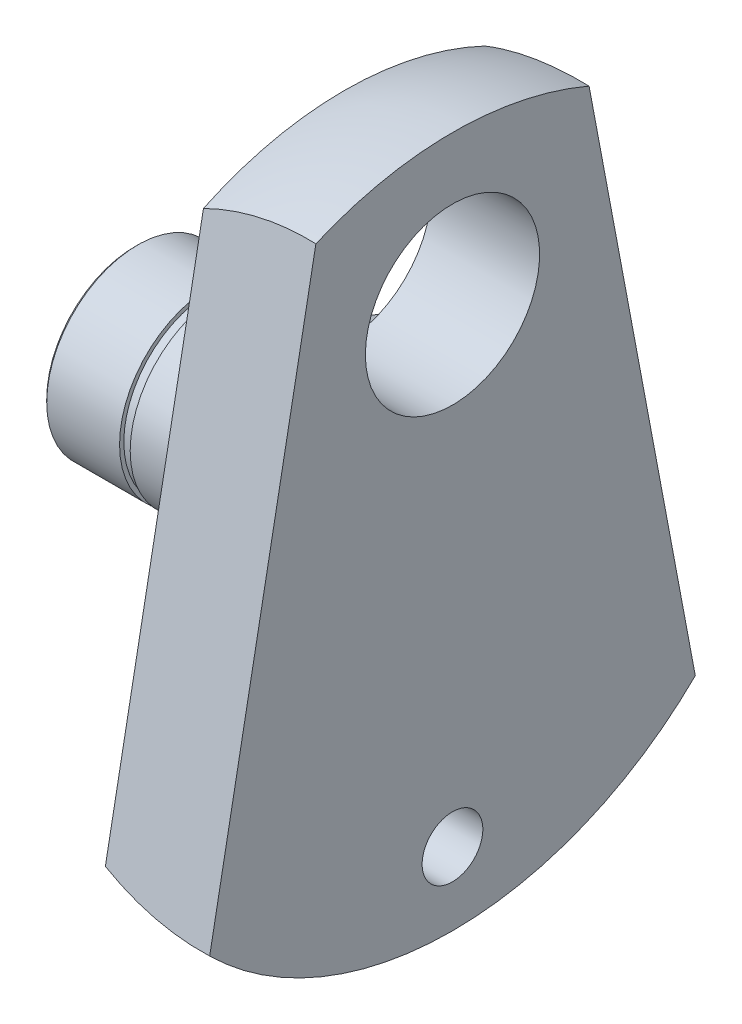
ISO-10303-21;
HEADER;
FILE_DESCRIPTION(('STEP AP214'),'2;1');
FILE_NAME('part.step','',(''),(''),'','','');
FILE_SCHEMA(('AUTOMOTIVE_DESIGN { 1 0 10303 214 1 1 1 1 }'));
ENDSEC;
DATA;
#1=APPLICATION_CONTEXT('core data for automotive mechanical design processes');
#2=APPLICATION_PROTOCOL_DEFINITION('international standard','automotive_design',2000,#1);
#3=PRODUCT_CONTEXT('',#1,'mechanical');
#4=PRODUCT('Part','Part','',(#3));
#5=PRODUCT_RELATED_PRODUCT_CATEGORY('part','',(#4));
#6=PRODUCT_DEFINITION_FORMATION('','',#4);
#7=PRODUCT_DEFINITION_CONTEXT('part definition',#1,'design');
#8=PRODUCT_DEFINITION('design','',#6,#7);
#9=PRODUCT_DEFINITION_SHAPE('','',#8);
#10=(LENGTH_UNIT() NAMED_UNIT(*) SI_UNIT(.MILLI.,.METRE.));
#11=(NAMED_UNIT(*) PLANE_ANGLE_UNIT() SI_UNIT($,.RADIAN.));
#12=(NAMED_UNIT(*) SI_UNIT($,.STERADIAN.) SOLID_ANGLE_UNIT());
#13=UNCERTAINTY_MEASURE_WITH_UNIT(LENGTH_MEASURE(1.E-05),#10,'distance_accuracy_value','');
#14=(GEOMETRIC_REPRESENTATION_CONTEXT(3) GLOBAL_UNCERTAINTY_ASSIGNED_CONTEXT((#13)) GLOBAL_UNIT_ASSIGNED_CONTEXT((#10,
#11,#12)) REPRESENTATION_CONTEXT('',''));
#15=CARTESIAN_POINT('',(0.,0.,0.));
#16=DIRECTION('',(0.,0.,1.));
#17=DIRECTION('',(1.,0.,0.));
#18=AXIS2_PLACEMENT_3D('',#15,#16,#17);
#19=CARTESIAN_POINT('',(50.9916987116164,0.,0.));
#20=DIRECTION('',(-1.,0.,0.));
#21=DIRECTION('',(0.,0.,1.));
#22=AXIS2_PLACEMENT_3D('',#19,#20,#21);
#23=DEGENERATE_TOROIDAL_SURFACE('',#22,9.629551863609,47.3396528102301,.T.);
#24=CARTESIAN_POINT('',(49.6433974232325,52.3168471909384,-22.5));
#25=DIRECTION('',(1.,0.,0.));
#26=VECTOR('',#25,1.);
#27=LINE('',#24,#26);
#28=CARTESIAN_POINT('',(49.6433974232326,52.3168471909384,-22.5));
#29=VERTEX_POINT('',#28);
#30=CARTESIAN_POINT('',(52.34,52.3168471909384,-22.5));
#31=VERTEX_POINT('',#30);
#32=EDGE_CURVE('E155',#29,#31,#27,.T.);
#33=ORIENTED_EDGE('',*,*,#32,.F.);
#34=CARTESIAN_POINT('',(52.3402,52.3168404401962,-22.5000012719218));
#35=CARTESIAN_POINT('',(51.8922340800582,52.3319644273639,-22.4971517291958));
#36=CARTESIAN_POINT('',(51.4440207996753,52.3395484620334,-22.4957228050248));
#37=CARTESIAN_POINT('',(50.5469014768168,52.3396396555874,-22.4957056230525));
#38=CARTESIAN_POINT('',(50.0979954317867,52.3321235492274,-22.4971217487056));
#39=CARTESIAN_POINT('',(48.997346334513,52.2951382826267,-22.5040902217836));
#40=CARTESIAN_POINT('',(48.3458777190375,52.2572637890464,-22.5112262360162));
#41=CARTESIAN_POINT('',(47.0455789290538,52.1496844068157,-22.5314954972038));
#42=CARTESIAN_POINT('',(46.3967492044861,52.079974302186,-22.5446297269127));
#43=CARTESIAN_POINT('',(45.1029150824546,51.908855652952,-22.5768705571116));
#44=CARTESIAN_POINT('',(44.4579140468863,51.8074225344776,-22.5959817876169));
#45=CARTESIAN_POINT('',(43.1737633900484,51.5731519901605,-22.6401212012561));
#46=CARTESIAN_POINT('',(42.5346145140416,51.4403106207536,-22.6651501274054));
#47=CARTESIAN_POINT('',(41.2624485231209,51.1432921301287,-22.7211120156334));
#48=CARTESIAN_POINT('',(40.6294475585458,50.9790482075019,-22.7520575639083));
#49=CARTESIAN_POINT('',(39.3725228233089,50.6198820617525,-22.8197288245811));
#50=CARTESIAN_POINT('',(38.7485990814374,50.4249597413499,-22.8564545553077));
#51=CARTESIAN_POINT('',(37.5116948620649,50.0051162045899,-22.9355581728232));
#52=CARTESIAN_POINT('',(36.8987082899079,49.7802123273565,-22.9779327927107));
#53=CARTESIAN_POINT('',(35.6848430477136,49.3009898068399,-23.0682241313849));
#54=CARTESIAN_POINT('',(35.0839630696745,49.0466743614236,-23.1161402476546));
#55=CARTESIAN_POINT('',(33.8539575595316,48.4904747545049,-23.2209350035952));
#56=CARTESIAN_POINT('',(33.2258074354549,48.1865051629799,-23.2782065635908));
#57=CARTESIAN_POINT('',(31.9866410875316,47.5467035617195,-23.3987529498529));
#58=CARTESIAN_POINT('',(31.3756229062772,47.21087521138,-23.4620270866447));
#59=CARTESIAN_POINT('',(30.1749988716298,46.5100224246711,-23.5940762571579));
#60=CARTESIAN_POINT('',(29.5853071831935,46.1451399437617,-23.6628245447479));
#61=CARTESIAN_POINT('',(28.4256892689205,45.3859218141827,-23.8058704541753));
#62=CARTESIAN_POINT('',(27.855767810012,44.9915791334679,-23.8801694009354));
#63=CARTESIAN_POINT('',(27.296524608117,44.583134475494,-23.9571253313516));
#64=B_SPLINE_CURVE_WITH_KNOTS('',3,(#34,#35,#36,#37,#38,#39,#40,#41,#42,#43,#44,#45,#46,#47,#48,
#49,#50,#51,#52,#53,#54,#55,#56,#57,#58,#59,#60,#61,#62,#63),.UNSPECIFIED.,.F.,.F.,(4,2,2,2,2,2,
2,2,2,2,2,2,2,2,4),(0.,1.3445926788894,2.69125860117035,4.64822855719358,6.60551926027995,
8.56432992744075,10.5233866701228,12.486658161328,14.4499358781183,16.4120830659365,
18.3740171132465,20.4735769754288,22.5728959669846,24.6625225079168,26.7526494388457),.UNSPECIFIED.);
#65=CARTESIAN_POINT('',(34.49,48.7780885509195,-23.166745073891));
#66=VERTEX_POINT('',#65);
#67=EDGE_CURVE('E218',#29,#66,#64,.T.);
#68=ORIENTED_EDGE('',*,*,#67,.T.);
#69=CARTESIAN_POINT('',(34.49,0.,0.));
#70=DIRECTION('',(-1.,0.,0.));
#71=DIRECTION('',(0.,0.,1.));
#72=AXIS2_PLACEMENT_3D('',#69,#70,#71);
#73=CIRCLE('',#72,54.);
#74=CARTESIAN_POINT('',(34.49,48.7761125704113,23.1709050863052));
#75=VERTEX_POINT('',#74);
#76=EDGE_CURVE('E111',#75,#66,#73,.T.);
#77=ORIENTED_EDGE('',*,*,#76,.F.);
#78=CARTESIAN_POINT('',(34.4898,48.7760221290406,23.1709221227226));
#79=CARTESIAN_POINT('',(34.9985487690953,49.0060927122528,23.1275837868577));
#80=CARTESIAN_POINT('',(35.5122313695224,49.225623225975,23.0862308811387));
#81=CARTESIAN_POINT('',(36.5485793296565,49.6431874765024,23.0075744119722));
#82=CARTESIAN_POINT('',(37.0712449026705,49.8412207020199,22.9702709448359));
#83=CARTESIAN_POINT('',(38.1249123312327,50.215456063163,22.8997763272829));
#84=CARTESIAN_POINT('',(38.6559182146935,50.3916472606922,22.8665872372725));
#85=CARTESIAN_POINT('',(39.7250208704862,50.7217057787584,22.8044142001492));
#86=CARTESIAN_POINT('',(40.2631175073682,50.8755735250531,22.7754301728364));
#87=CARTESIAN_POINT('',(41.8657837833936,51.2977002809363,22.6959142657239));
#88=CARTESIAN_POINT('',(42.9393168247256,51.5337771964053,22.6514445186154));
#89=CARTESIAN_POINT('',(45.1021444662606,51.9167263931984,22.5793084781094));
#90=CARTESIAN_POINT('',(46.1914296918681,52.0636496628526,22.5516325800535));
#91=CARTESIAN_POINT('',(47.7031322203619,52.2044570945579,22.5251087207999));
#92=CARTESIAN_POINT('',(48.1221083930666,52.2368251331592,22.519011561795));
#93=CARTESIAN_POINT('',(48.9608459690585,52.2883346267266,22.5093087319013));
#94=CARTESIAN_POINT('',(49.3806072070125,52.3074786077601,22.5057025851778));
#95=CARTESIAN_POINT('',(50.2236832518271,52.3326144540111,22.5009677523632));
#96=CARTESIAN_POINT('',(50.6470010951503,52.338506583217,22.4998578535186));
#97=CARTESIAN_POINT('',(51.4936900236198,52.3368426022889,22.5001712971728));
#98=CARTESIAN_POINT('',(51.9170611035511,52.3292839306374,22.501595122184));
#99=CARTESIAN_POINT('',(52.3402,52.3149973718824,22.5042862775375));
#100=B_SPLINE_CURVE_WITH_KNOTS('',3,(#78,#79,#80,#81,#82,#83,#84,#85,#86,#87,#88,#89,#90,#91,
#92,#93,#94,#95,#96,#97,#98,#99),.UNSPECIFIED.,.F.,.F.,(4,2,2,2,2,2,2,2,2,2,4),(0.,
1.67996778962396,3.35997552655231,5.04082121152247,6.72163483482562,10.017821598373,
13.312121441293,14.5727700901148,15.8331778624287,17.1030404087409,18.3731448085514),.UNSPECIFIED.);
#101=CARTESIAN_POINT('',(52.34,52.3150041228629,22.504285005857));
#102=VERTEX_POINT('',#101);
#103=EDGE_CURVE('E178',#75,#102,#100,.T.);
#104=ORIENTED_EDGE('',*,*,#103,.T.);
#105=CARTESIAN_POINT('',(52.34,0.,0.));
#106=DIRECTION('',(-1.,0.,0.));
#107=DIRECTION('',(0.,0.,1.));
#108=AXIS2_PLACEMENT_3D('',#105,#106,#107);
#109=CIRCLE('',#108,56.95);
#110=EDGE_CURVE('E227',#102,#31,#109,.T.);
#111=ORIENTED_EDGE('',*,*,#110,.T.);
#112=EDGE_LOOP('',(#33,#68,#77,#104,#111));
#113=FACE_BOUND('',#112,.T.);
#114=ADVANCED_FACE('F35',(#113),#23,.T.);
#115=CARTESIAN_POINT('',(5.1,12.,0.));
#116=DIRECTION('',(1.,0.,0.));
#117=DIRECTION('',(0.,0.,-1.));
#118=AXIS2_PLACEMENT_3D('',#115,#116,#117);
#119=PLANE('',#118);
#120=CARTESIAN_POINT('',(5.1,9.00000000000001,0.));
#121=DIRECTION('',(-1.,0.,0.));
#122=DIRECTION('',(0.,0.,1.));
#123=AXIS2_PLACEMENT_3D('',#120,#121,#122);
#124=CIRCLE('',#123,2.);
#125=CARTESIAN_POINT('',(5.1,9.00000000000001,2.));
#126=VERTEX_POINT('',#125);
#127=EDGE_CURVE('E247',#126,#126,#124,.T.);
#128=ORIENTED_EDGE('',*,*,#127,.F.);
#129=EDGE_LOOP('',(#128));
#130=FACE_BOUND('',#129,.T.);
#131=CARTESIAN_POINT('',(5.1,0.,0.));
#132=DIRECTION('',(-1.,0.,0.));
#133=DIRECTION('',(0.,0.,1.));
#134=AXIS2_PLACEMENT_3D('',#131,#132,#133);
#135=CIRCLE('',#134,4.7);
#136=CARTESIAN_POINT('',(5.1,0.,4.7));
#137=VERTEX_POINT('',#136);
#138=EDGE_CURVE('E239',#137,#137,#135,.T.);
#139=ORIENTED_EDGE('',*,*,#138,.F.);
#140=EDGE_LOOP('',(#139));
#141=FACE_BOUND('',#140,.T.);
#142=CARTESIAN_POINT('',(5.1,0.,0.));
#143=DIRECTION('',(-1.,0.,0.));
#144=DIRECTION('',(0.,0.,1.));
#145=AXIS2_PLACEMENT_3D('',#142,#143,#144);
#146=CIRCLE('',#145,12.);
#147=CARTESIAN_POINT('',(5.1,0.,12.));
#148=VERTEX_POINT('',#147);
#149=EDGE_CURVE('E146',#148,#148,#146,.T.);
#150=ORIENTED_EDGE('',*,*,#149,.T.);
#151=EDGE_LOOP('',(#150));
#152=FACE_BOUND('',#151,.T.);
#153=ADVANCED_FACE('F37',(#130,#141,#152),#119,.F.);
#154=CARTESIAN_POINT('',(0.,0.,0.));
#155=DIRECTION('',(-1.,0.,0.));
#156=DIRECTION('',(0.,0.,1.));
#157=AXIS2_PLACEMENT_3D('',#154,#155,#156);
#158=CYLINDRICAL_SURFACE('',#157,12.);
#159=ORIENTED_EDGE('',*,*,#149,.F.);
#160=EDGE_LOOP('',(#159));
#161=FACE_BOUND('',#160,.T.);
#162=CARTESIAN_POINT('',(0.5,0.,0.));
#163=DIRECTION('',(-1.,0.,0.));
#164=DIRECTION('',(0.,0.,1.));
#165=AXIS2_PLACEMENT_3D('',#162,#163,#164);
#166=CIRCLE('',#165,12.);
#167=CARTESIAN_POINT('',(0.5,0.,12.));
#168=VERTEX_POINT('',#167);
#169=EDGE_CURVE('E143',#168,#168,#166,.T.);
#170=ORIENTED_EDGE('',*,*,#169,.T.);
#171=EDGE_LOOP('',(#170));
#172=FACE_BOUND('',#171,.T.);
#173=ADVANCED_FACE('F269',(#161,#172),#158,.F.);
#174=CARTESIAN_POINT('',(0.,0.,0.));
#175=DIRECTION('',(-1.,0.,0.));
#176=DIRECTION('',(0.,0.,1.));
#177=AXIS2_PLACEMENT_3D('',#174,#175,#176);
#178=CONICAL_SURFACE('',#177,12.5,0.785398163397449);
#179=ORIENTED_EDGE('',*,*,#169,.F.);
#180=EDGE_LOOP('',(#179));
#181=FACE_BOUND('',#180,.T.);
#182=CARTESIAN_POINT('',(0.,0.,0.));
#183=DIRECTION('',(-1.,0.,0.));
#184=DIRECTION('',(0.,0.,1.));
#185=AXIS2_PLACEMENT_3D('',#182,#183,#184);
#186=CIRCLE('',#185,12.5);
#187=CARTESIAN_POINT('',(0.,0.,12.5));
#188=VERTEX_POINT('',#187);
#189=EDGE_CURVE('E140',#188,#188,#186,.T.);
#190=ORIENTED_EDGE('',*,*,#189,.T.);
#191=EDGE_LOOP('',(#190));
#192=FACE_BOUND('',#191,.T.);
#193=ADVANCED_FACE('F274',(#181,#192),#178,.F.);
#194=CARTESIAN_POINT('',(0.,14.5,0.));
#195=DIRECTION('',(1.,0.,0.));
#196=DIRECTION('',(0.,0.,-1.));
#197=AXIS2_PLACEMENT_3D('',#194,#195,#196);
#198=PLANE('',#197);
#199=ORIENTED_EDGE('',*,*,#189,.F.);
#200=EDGE_LOOP('',(#199));
#201=FACE_BOUND('',#200,.T.);
#202=CARTESIAN_POINT('',(0.,0.,0.));
#203=DIRECTION('',(-1.,0.,0.));
#204=DIRECTION('',(0.,0.,1.));
#205=AXIS2_PLACEMENT_3D('',#202,#203,#204);
#206=CIRCLE('',#205,14.5);
#207=CARTESIAN_POINT('',(0.,0.,14.5));
#208=VERTEX_POINT('',#207);
#209=EDGE_CURVE('E137',#208,#208,#206,.T.);
#210=ORIENTED_EDGE('',*,*,#209,.T.);
#211=EDGE_LOOP('',(#210));
#212=FACE_BOUND('',#211,.T.);
#213=ADVANCED_FACE('F287',(#201,#212),#198,.F.);
#214=CARTESIAN_POINT('',(0.5,0.,0.));
#215=DIRECTION('',(1.,0.,0.));
#216=DIRECTION('',(0.,0.,-1.));
#217=AXIS2_PLACEMENT_3D('',#214,#215,#216);
#218=CONICAL_SURFACE('',#217,15.,0.785398163397449);
#219=ORIENTED_EDGE('',*,*,#209,.F.);
#220=EDGE_LOOP('',(#219));
#221=FACE_BOUND('',#220,.T.);
#222=CARTESIAN_POINT('',(0.5,0.,0.));
#223=DIRECTION('',(-1.,0.,0.));
#224=DIRECTION('',(0.,0.,1.));
#225=AXIS2_PLACEMENT_3D('',#222,#223,#224);
#226=CIRCLE('',#225,15.);
#227=CARTESIAN_POINT('',(0.5,0.,15.));
#228=VERTEX_POINT('',#227);
#229=EDGE_CURVE('E134',#228,#228,#226,.T.);
#230=ORIENTED_EDGE('',*,*,#229,.T.);
#231=EDGE_LOOP('',(#230));
#232=FACE_BOUND('',#231,.T.);
#233=ADVANCED_FACE('F293',(#221,#232),#218,.T.);
#234=CARTESIAN_POINT('',(0.,0.,0.));
#235=DIRECTION('',(-1.,0.,0.));
#236=DIRECTION('',(0.,0.,1.));
#237=AXIS2_PLACEMENT_3D('',#234,#235,#236);
#238=CYLINDRICAL_SURFACE('',#237,15.);
#239=ORIENTED_EDGE('',*,*,#229,.F.);
#240=EDGE_LOOP('',(#239));
#241=FACE_BOUND('',#240,.T.);
#242=CARTESIAN_POINT('',(12.5,0.,0.));
#243=DIRECTION('',(-1.,0.,0.));
#244=DIRECTION('',(0.,0.,1.));
#245=AXIS2_PLACEMENT_3D('',#242,#243,#244);
#246=CIRCLE('',#245,15.);
#247=CARTESIAN_POINT('',(12.5,0.,15.));
#248=VERTEX_POINT('',#247);
#249=EDGE_CURVE('E131',#248,#248,#246,.T.);
#250=ORIENTED_EDGE('',*,*,#249,.T.);
#251=EDGE_LOOP('',(#250));
#252=FACE_BOUND('',#251,.T.);
#253=ADVANCED_FACE('F299',(#241,#252),#238,.T.);
#254=CARTESIAN_POINT('',(12.5,15.,0.));
#255=DIRECTION('',(-1.,0.,0.));
#256=DIRECTION('',(0.,0.,1.));
#257=AXIS2_PLACEMENT_3D('',#254,#255,#256);
#258=PLANE('',#257);
#259=ORIENTED_EDGE('',*,*,#249,.F.);
#260=EDGE_LOOP('',(#259));
#261=FACE_BOUND('',#260,.T.);
#262=CARTESIAN_POINT('',(12.5,0.,0.));
#263=DIRECTION('',(-1.,0.,0.));
#264=DIRECTION('',(0.,0.,1.));
#265=AXIS2_PLACEMENT_3D('',#262,#263,#264);
#266=CIRCLE('',#265,14.3);
#267=CARTESIAN_POINT('',(12.5,0.,14.3));
#268=VERTEX_POINT('',#267);
#269=EDGE_CURVE('E128',#268,#268,#266,.T.);
#270=ORIENTED_EDGE('',*,*,#269,.T.);
#271=EDGE_LOOP('',(#270));
#272=FACE_BOUND('',#271,.T.);
#273=ADVANCED_FACE('F305',(#261,#272),#258,.F.);
#274=CARTESIAN_POINT('',(0.,0.,0.));
#275=DIRECTION('',(-1.,0.,0.));
#276=DIRECTION('',(0.,0.,1.));
#277=AXIS2_PLACEMENT_3D('',#274,#275,#276);
#278=CYLINDRICAL_SURFACE('',#277,14.3);
#279=ORIENTED_EDGE('',*,*,#269,.F.);
#280=EDGE_LOOP('',(#279));
#281=FACE_BOUND('',#280,.T.);
#282=CARTESIAN_POINT('',(14.25,0.,0.));
#283=DIRECTION('',(-1.,0.,0.));
#284=DIRECTION('',(0.,0.,1.));
#285=AXIS2_PLACEMENT_3D('',#282,#283,#284);
#286=CIRCLE('',#285,14.3);
#287=CARTESIAN_POINT('',(14.25,0.,14.3));
#288=VERTEX_POINT('',#287);
#289=EDGE_CURVE('E125',#288,#288,#286,.T.);
#290=ORIENTED_EDGE('',*,*,#289,.T.);
#291=EDGE_LOOP('',(#290));
#292=FACE_BOUND('',#291,.T.);
#293=ADVANCED_FACE('F311',(#281,#292),#278,.T.);
#294=CARTESIAN_POINT('',(14.25,14.3,0.));
#295=DIRECTION('',(1.,0.,0.));
#296=DIRECTION('',(0.,0.,-1.));
#297=AXIS2_PLACEMENT_3D('',#294,#295,#296);
#298=PLANE('',#297);
#299=ORIENTED_EDGE('',*,*,#289,.F.);
#300=EDGE_LOOP('',(#299));
#301=FACE_BOUND('',#300,.T.);
#302=CARTESIAN_POINT('',(14.25,0.,0.));
#303=DIRECTION('',(-1.,0.,0.));
#304=DIRECTION('',(0.,0.,1.));
#305=AXIS2_PLACEMENT_3D('',#302,#303,#304);
#306=CIRCLE('',#305,15.);
#307=CARTESIAN_POINT('',(14.25,0.,15.));
#308=VERTEX_POINT('',#307);
#309=EDGE_CURVE('E122',#308,#308,#306,.T.);
#310=ORIENTED_EDGE('',*,*,#309,.T.);
#311=EDGE_LOOP('',(#310));
#312=FACE_BOUND('',#311,.T.);
#313=ADVANCED_FACE('F317',(#301,#312),#298,.F.);
#314=CARTESIAN_POINT('',(0.,0.,0.));
#315=DIRECTION('',(-1.,0.,0.));
#316=DIRECTION('',(0.,0.,1.));
#317=AXIS2_PLACEMENT_3D('',#314,#315,#316);
#318=CYLINDRICAL_SURFACE('',#317,15.);
#319=ORIENTED_EDGE('',*,*,#309,.F.);
#320=EDGE_LOOP('',(#319));
#321=FACE_BOUND('',#320,.T.);
#322=CARTESIAN_POINT('',(32.68,0.,0.));
#323=DIRECTION('',(-1.,0.,0.));
#324=DIRECTION('',(0.,0.,1.));
#325=AXIS2_PLACEMENT_3D('',#322,#323,#324);
#326=CIRCLE('',#325,15.);
#327=CARTESIAN_POINT('',(32.68,0.,15.));
#328=VERTEX_POINT('',#327);
#329=EDGE_CURVE('E113',#328,#328,#326,.T.);
#330=ORIENTED_EDGE('',*,*,#329,.T.);
#331=EDGE_LOOP('',(#330));
#332=FACE_BOUND('',#331,.T.);
#333=ADVANCED_FACE('F323',(#321,#332),#318,.T.);
#334=CARTESIAN_POINT('',(32.68,15.,0.));
#335=DIRECTION('',(1.,0.,0.));
#336=DIRECTION('',(0.,0.,-1.));
#337=AXIS2_PLACEMENT_3D('',#334,#335,#336);
#338=PLANE('',#337);
#339=ORIENTED_EDGE('',*,*,#329,.F.);
#340=EDGE_LOOP('',(#339));
#341=FACE_BOUND('',#340,.T.);
#342=CARTESIAN_POINT('',(32.68,0.,0.));
#343=DIRECTION('',(-1.,0.,0.));
#344=DIRECTION('',(0.,0.,1.));
#345=AXIS2_PLACEMENT_3D('',#342,#343,#344);
#346=CIRCLE('',#345,19.);
#347=CARTESIAN_POINT('',(32.68,18.5931712962963,-3.91075199246694));
#348=VERTEX_POINT('',#347);
#349=CARTESIAN_POINT('',(32.68,18.5931712962963,3.91075199246694));
#350=VERTEX_POINT('',#349);
#351=EDGE_CURVE('E106',#348,#350,#346,.T.);
#352=ORIENTED_EDGE('',*,*,#351,.T.);
#353=CARTESIAN_POINT('',(32.68,32.4,0.));
#354=DIRECTION('',(1.,0.,0.));
#355=DIRECTION('',(0.,0.,-1.));
#356=AXIS2_PLACEMENT_3D('',#353,#354,#355);
#357=CIRCLE('',#356,14.35);
#358=EDGE_CURVE('E107',#350,#348,#357,.T.);
#359=ORIENTED_EDGE('',*,*,#358,.T.);
#360=EDGE_LOOP('',(#352,#359));
#361=FACE_BOUND('',#360,.T.);
#362=ADVANCED_FACE('F329',(#341,#361),#338,.F.);
#363=CARTESIAN_POINT('',(0.,0.,0.));
#364=DIRECTION('',(-1.,0.,0.));
#365=DIRECTION('',(0.,0.,1.));
#366=AXIS2_PLACEMENT_3D('',#363,#364,#365);
#367=CYLINDRICAL_SURFACE('',#366,19.);
#368=ORIENTED_EDGE('',*,*,#351,.F.);
#369=DIRECTION('',(-1.,0.,0.));
#370=VECTOR('',#369,1.);
#371=CARTESIAN_POINT('',(34.49,18.5931712962963,-3.91075199246694));
#372=LINE('',#371,#370);
#373=CARTESIAN_POINT('',(34.49,18.5931712962963,-3.91075199246694));
#374=VERTEX_POINT('',#373);
#375=EDGE_CURVE('E94',#348,#374,#372,.F.);
#376=ORIENTED_EDGE('',*,*,#375,.T.);
#377=CARTESIAN_POINT('',(34.49,0.,0.));
#378=DIRECTION('',(-1.,0.,0.));
#379=DIRECTION('',(0.,0.,1.));
#380=AXIS2_PLACEMENT_3D('',#377,#378,#379);
#381=CIRCLE('',#380,19.);
#382=CARTESIAN_POINT('',(34.49,18.5931712962963,3.91075199246694));
#383=VERTEX_POINT('',#382);
#384=EDGE_CURVE('E104',#374,#383,#381,.T.);
#385=ORIENTED_EDGE('',*,*,#384,.T.);
#386=DIRECTION('',(-1.,0.,0.));
#387=VECTOR('',#386,1.);
#388=CARTESIAN_POINT('',(34.49,18.5931712962963,3.91075199246694));
#389=LINE('',#388,#387);
#390=EDGE_CURVE('E52',#383,#350,#389,.T.);
#391=ORIENTED_EDGE('',*,*,#390,.T.);
#392=EDGE_LOOP('',(#368,#376,#385,#391));
#393=FACE_BOUND('',#392,.T.);
#394=ADVANCED_FACE('F103',(#393),#367,.T.);
#395=CARTESIAN_POINT('',(34.49,19.,0.));
#396=DIRECTION('',(1.,0.,0.));
#397=DIRECTION('',(0.,0.,-1.));
#398=AXIS2_PLACEMENT_3D('',#395,#396,#397);
#399=PLANE('',#398);
#400=CARTESIAN_POINT('',(34.49,-44.9499997866061,0.00437996724736729));
#401=DIRECTION('',(1.,0.,0.));
#402=DIRECTION('',(0.,0.,-1.));
#403=AXIS2_PLACEMENT_3D('',#400,#401,#402);
#404=CIRCLE('',#403,4.99999999998008);
#405=CARTESIAN_POINT('',(34.49,-44.9499997866061,-4.99562003273271));
#406=VERTEX_POINT('',#405);
#407=EDGE_CURVE('E230',#406,#406,#404,.T.);
#408=ORIENTED_EDGE('',*,*,#407,.T.);
#409=EDGE_LOOP('',(#408));
#410=FACE_BOUND('',#409,.T.);
#411=ORIENTED_EDGE('',*,*,#384,.F.);
#412=CARTESIAN_POINT('',(34.49,32.4,0.));
#413=DIRECTION('',(1.,0.,0.));
#414=DIRECTION('',(0.,0.,-1.));
#415=AXIS2_PLACEMENT_3D('',#412,#413,#414);
#416=CIRCLE('',#415,14.35);
#417=EDGE_CURVE('E91',#374,#383,#416,.T.);
#418=ORIENTED_EDGE('',*,*,#417,.T.);
#419=EDGE_LOOP('',(#411,#418));
#420=FACE_BOUND('',#419,.T.);
#421=ORIENTED_EDGE('',*,*,#76,.T.);
#422=DIRECTION('',(0.,-0.982709445112043,-0.185154385547791));
#423=VECTOR('',#422,1.);
#424=CARTESIAN_POINT('',(34.49,24.236114714243,-27.7907507842887));
#425=LINE('',#424,#423);
#426=CARTESIAN_POINT('',(34.49,-37.0031375559054,-39.3289691069921));
#427=VERTEX_POINT('',#426);
#428=EDGE_CURVE('E202',#66,#427,#425,.T.);
#429=ORIENTED_EDGE('',*,*,#428,.T.);
#430=CARTESIAN_POINT('',(34.49,-37.0030038411692,39.3290949136949));
#431=VERTEX_POINT('',#430);
#432=EDGE_CURVE('E116',#427,#431,#73,.T.);
#433=ORIENTED_EDGE('',*,*,#432,.T.);
#434=DIRECTION('',(0.,0.98271702509007,-0.185114150183404));
#435=VECTOR('',#434,1.);
#436=CARTESIAN_POINT('',(34.49,24.2354766412567,27.7936182875641));
#437=LINE('',#436,#435);
#438=EDGE_CURVE('E252',#431,#75,#437,.T.);
#439=ORIENTED_EDGE('',*,*,#438,.T.);
#440=EDGE_LOOP('',(#421,#429,#433,#439));
#441=FACE_BOUND('',#440,.T.);
#442=ADVANCED_FACE('F109',(#410,#420,#441),#399,.F.);
#443=CARTESIAN_POINT('',(52.34,-40.5418961959243,-39.9957141808831));
#444=VERTEX_POINT('',#443);
#445=CARTESIAN_POINT('',(52.34,-40.5418953936207,39.995714994143));
#446=VERTEX_POINT('',#445);
#447=EDGE_CURVE('E224',#444,#446,#109,.T.);
#448=ORIENTED_EDGE('',*,*,#447,.T.);
#449=CARTESIAN_POINT('',(52.3402,-40.5418886426403,39.9957137224625));
#450=CARTESIAN_POINT('',(51.7804847454745,-40.5607914192834,39.9992744335778));
#451=CARTESIAN_POINT('',(51.2203625013196,-40.567914704352,40.0006162449317));
#452=CARTESIAN_POINT('',(50.1003149051041,-40.5586246235221,39.9988662748243));
#453=CARTESIAN_POINT('',(49.5403895549032,-40.5422110410025,39.9957744525581));
#454=CARTESIAN_POINT('',(48.4215423848204,-40.4858584027086,39.9851593207531));
#455=CARTESIAN_POINT('',(47.8626210323351,-40.4459103241575,39.9776343115962));
#456=CARTESIAN_POINT('',(46.7470682909149,-40.3425789980817,39.9581698166037));
#457=CARTESIAN_POINT('',(46.1904368676508,-40.2791961031816,39.946230397192));
#458=CARTESIAN_POINT('',(44.5467523105315,-40.0569486769296,39.9043657073671));
#459=CARTESIAN_POINT('',(43.4641699682323,-39.8648688225114,39.8681836751949));
#460=CARTESIAN_POINT('',(41.3196723996274,-39.3926054448646,39.7792235456929));
#461=CARTESIAN_POINT('',(40.257746426283,-39.1124691120493,39.7264543376089));
#462=CARTESIAN_POINT('',(38.8087763627141,-38.665949326984,39.6423435219396));
#463=CARTESIAN_POINT('',(38.4097923838084,-38.5360976706122,39.6178833992334));
#464=CARTESIAN_POINT('',(37.6162822225327,-38.2640147604885,39.5666312122854));
#465=CARTESIAN_POINT('',(37.2217551741398,-38.1217859601571,39.5398396101937));
#466=CARTESIAN_POINT('',(36.4345692517202,-37.8239917305121,39.4837441886808));
#467=CARTESIAN_POINT('',(36.0419463372662,-37.6683346284648,39.4544231008907));
#468=CARTESIAN_POINT('',(35.2618758698394,-37.3447646760864,39.3934723131969));
#469=CARTESIAN_POINT('',(34.8744293281376,-37.1768494712276,39.3618421697713));
#470=CARTESIAN_POINT('',(34.4898,-37.0029133997985,39.3290778772774));
#471=B_SPLINE_CURVE_WITH_KNOTS('',3,(#449,#450,#451,#452,#453,#454,#455,#456,#457,#458,#459,
#460,#461,#462,#463,#464,#465,#466,#467,#468,#469,#470),.UNSPECIFIED.,.F.,.F.,(4,2,2,2,2,2,2,2,
2,2,4),(0.,1.67999960959292,3.3600146811174,5.04067426504575,6.72130856105547,10.0174848221714,
13.3118976300206,14.5726282934677,15.8331096193086,17.1030050104828,18.3731449673367),.UNSPECIFIED.);
#472=EDGE_CURVE('E60',#446,#431,#471,.T.);
#473=ORIENTED_EDGE('',*,*,#472,.T.);
#474=ORIENTED_EDGE('',*,*,#432,.F.);
#475=CARTESIAN_POINT('',(34.4898,-37.0030471181542,-39.3289520674223));
#476=CARTESIAN_POINT('',(34.9985650784615,-37.2331158692114,-39.3722998122187));
#477=CARTESIAN_POINT('',(35.5122639946489,-37.4526442767896,-39.4136616283868));
#478=CARTESIAN_POINT('',(36.5486445640293,-37.8702037780662,-39.4923349058984));
#479=CARTESIAN_POINT('',(37.0713264305166,-38.0682343604934,-39.5296462709121));
#480=CARTESIAN_POINT('',(38.1250264098475,-38.4424639131925,-39.6001556602626));
#481=CARTESIAN_POINT('',(38.656048550766,-38.6186519445878,-39.6333516235823));
#482=CARTESIAN_POINT('',(39.7251836305429,-38.9487036164841,-39.6955373640501));
#483=CARTESIAN_POINT('',(40.2632964339532,-39.1025676827522,-39.7245272214178));
#484=CARTESIAN_POINT('',(41.8660109948378,-39.524682953949,-39.8040588612708));
#485=CARTESIAN_POINT('',(42.939575997772,-39.7607513014586,-39.8485370028495));
#486=CARTESIAN_POINT('',(45.1024668378019,-40.1436814362908,-39.9206856874635));
#487=CARTESIAN_POINT('',(46.191783300198,-40.2905942157106,-39.9483658380288));
#488=CARTESIAN_POINT('',(47.703485336334,-40.4313818856523,-39.9748919436345));
#489=CARTESIAN_POINT('',(48.1224300716791,-40.4637427826457,-39.9809891293575));
#490=CARTESIAN_POINT('',(48.9611045052806,-40.5152404571605,-39.990691916208));
#491=CARTESIAN_POINT('',(49.3808340382615,-40.5343797602061,-39.9942979931749));
#492=CARTESIAN_POINT('',(50.2238458687791,-40.5595086862276,-39.9990325878002));
#493=CARTESIAN_POINT('',(50.6471312012403,-40.5653986050037,-40.0001423199772));
#494=CARTESIAN_POINT('',(51.4937550708408,-40.5637327432476,-39.9998284514056));
#495=CARTESIAN_POINT('',(51.9170936027599,-40.5561744017667,-39.9984043681431));
#496=CARTESIAN_POINT('',(52.3402,-40.5418894451821,-39.9957129089614));
#497=B_SPLINE_CURVE_WITH_KNOTS('',3,(#475,#476,#477,#478,#479,#480,#481,#482,#483,#484,#485,
#486,#487,#488,#489,#490,#491,#492,#493,#494,#495,#496),.UNSPECIFIED.,.F.,.F.,(4,2,2,2,2,2,2,2,
2,2,4),(0.,1.68001215951533,3.3600642651122,5.040954380561,6.72181243353318,10.0180881645,
13.3124768252597,14.5730298577913,15.8333420390217,17.1031070318501,18.3731138515745),.UNSPECIFIED.);
#498=EDGE_CURVE('E192',#427,#444,#497,.T.);
#499=ORIENTED_EDGE('',*,*,#498,.T.);
#500=EDGE_LOOP('',(#448,#473,#474,#499));
#501=FACE_BOUND('',#500,.T.);
#502=ADVANCED_FACE('F161',(#501),#23,.T.);
#503=CARTESIAN_POINT('',(52.34,56.95,0.));
#504=DIRECTION('',(-1.,0.,0.));
#505=DIRECTION('',(0.,0.,1.));
#506=AXIS2_PLACEMENT_3D('',#503,#504,#505);
#507=PLANE('',#506);
#508=CARTESIAN_POINT('',(52.34,-44.9499997866061,0.00437996724736729));
#509=DIRECTION('',(-1.,0.,0.));
#510=DIRECTION('',(0.,0.,1.));
#511=AXIS2_PLACEMENT_3D('',#508,#509,#510);
#512=CIRCLE('',#511,4.99999999998008);
#513=CARTESIAN_POINT('',(52.34,-44.9499997866061,5.00437996722745));
#514=VERTEX_POINT('',#513);
#515=EDGE_CURVE('E231',#514,#514,#512,.T.);
#516=ORIENTED_EDGE('',*,*,#515,.T.);
#517=EDGE_LOOP('',(#516));
#518=FACE_BOUND('',#517,.T.);
#519=CARTESIAN_POINT('',(52.34,32.4,0.));
#520=DIRECTION('',(-1.,0.,0.));
#521=DIRECTION('',(0.,0.,1.));
#522=AXIS2_PLACEMENT_3D('',#519,#520,#521);
#523=CIRCLE('',#522,14.35);
#524=CARTESIAN_POINT('',(52.34,32.4,14.35));
#525=VERTEX_POINT('',#524);
#526=EDGE_CURVE('E99',#525,#525,#523,.T.);
#527=ORIENTED_EDGE('',*,*,#526,.T.);
#528=EDGE_LOOP('',(#527));
#529=FACE_BOUND('',#528,.T.);
#530=ORIENTED_EDGE('',*,*,#447,.F.);
#531=DIRECTION('',(0.,0.982709445112043,0.185154385547791));
#532=VECTOR('',#531,1.);
#533=CARTESIAN_POINT('',(52.34,60.8851072550393,-20.885635820157));
#534=LINE('',#533,#532);
#535=EDGE_CURVE('E11',#444,#31,#534,.T.);
#536=ORIENTED_EDGE('',*,*,#535,.T.);
#537=ORIENTED_EDGE('',*,*,#110,.F.);
#538=DIRECTION('',(0.,-0.98271702509007,0.185114150183404));
#539=VECTOR('',#538,1.);
#540=CARTESIAN_POINT('',(52.34,60.8850345569579,20.8899506040408));
#541=LINE('',#540,#539);
#542=EDGE_CURVE('E44',#102,#446,#541,.T.);
#543=ORIENTED_EDGE('',*,*,#542,.T.);
#544=EDGE_LOOP('',(#530,#536,#537,#543));
#545=FACE_BOUND('',#544,.T.);
#546=ADVANCED_FACE('F171',(#518,#529,#545),#507,.F.);
#547=CARTESIAN_POINT('',(-214.023464499332,52.3377519690115,22.5));
#548=DIRECTION('',(0.,-0.185114150183404,-0.982717025090069));
#549=DIRECTION('',(0.,0.98271702509007,-0.185114150183404));
#550=AXIS2_PLACEMENT_3D('',#547,#548,#549);
#551=PLANE('',#550);
#552=ORIENTED_EDGE('',*,*,#472,.F.);
#553=ORIENTED_EDGE('',*,*,#542,.F.);
#554=ORIENTED_EDGE('',*,*,#103,.F.);
#555=ORIENTED_EDGE('',*,*,#438,.F.);
#556=EDGE_LOOP('',(#552,#553,#554,#555));
#557=FACE_BOUND('',#556,.T.);
#558=ADVANCED_FACE('F209',(#557),#551,.F.);
#559=CARTESIAN_POINT('',(-214.023464499332,52.3168471909384,-22.5));
#560=DIRECTION('',(0.,-0.185154385547791,0.982709445112043));
#561=DIRECTION('',(0.,-0.982709445112043,-0.185154385547791));
#562=AXIS2_PLACEMENT_3D('',#559,#560,#561);
#563=PLANE('',#562);
#564=ORIENTED_EDGE('',*,*,#67,.F.);
#565=ORIENTED_EDGE('',*,*,#32,.T.);
#566=ORIENTED_EDGE('',*,*,#535,.F.);
#567=ORIENTED_EDGE('',*,*,#498,.F.);
#568=ORIENTED_EDGE('',*,*,#428,.F.);
#569=EDGE_LOOP('',(#564,#565,#566,#567,#568));
#570=FACE_BOUND('',#569,.T.);
#571=ADVANCED_FACE('F206',(#570),#563,.F.);
#572=CARTESIAN_POINT('',(59.49,32.4,0.));
#573=DIRECTION('',(-1.,0.,0.));
#574=DIRECTION('',(0.,0.,1.));
#575=AXIS2_PLACEMENT_3D('',#572,#573,#574);
#576=CYLINDRICAL_SURFACE('',#575,14.35);
#577=ORIENTED_EDGE('',*,*,#526,.F.);
#578=EDGE_LOOP('',(#577));
#579=FACE_BOUND('',#578,.T.);
#580=ORIENTED_EDGE('',*,*,#390,.F.);
#581=ORIENTED_EDGE('',*,*,#417,.F.);
#582=ORIENTED_EDGE('',*,*,#375,.F.);
#583=ORIENTED_EDGE('',*,*,#358,.F.);
#584=EDGE_LOOP('',(#580,#581,#582,#583));
#585=FACE_BOUND('',#584,.T.);
#586=ADVANCED_FACE('F93',(#579,#585),#576,.F.);
#587=CARTESIAN_POINT('',(59.49,-44.9499997866061,0.00437996724736729));
#588=DIRECTION('',(-1.,0.,0.));
#589=DIRECTION('',(0.,0.,1.));
#590=AXIS2_PLACEMENT_3D('',#587,#588,#589);
#591=CYLINDRICAL_SURFACE('',#590,4.99999999998008);
#592=ORIENTED_EDGE('',*,*,#515,.F.);
#593=EDGE_LOOP('',(#592));
#594=FACE_BOUND('',#593,.T.);
#595=ORIENTED_EDGE('',*,*,#407,.F.);
#596=EDGE_LOOP('',(#595));
#597=FACE_BOUND('',#596,.T.);
#598=ADVANCED_FACE('F346',(#594,#597),#591,.F.);
#599=CARTESIAN_POINT('',(11.1,0.,0.));
#600=DIRECTION('',(-1.,0.,0.));
#601=DIRECTION('',(0.,0.,1.));
#602=AXIS2_PLACEMENT_3D('',#599,#600,#601);
#603=CYLINDRICAL_SURFACE('',#602,4.7);
#604=CARTESIAN_POINT('',(11.1,0.,0.));
#605=DIRECTION('',(-1.,0.,0.));
#606=DIRECTION('',(0.,0.,1.));
#607=AXIS2_PLACEMENT_3D('',#604,#605,#606);
#608=CIRCLE('',#607,4.7);
#609=CARTESIAN_POINT('',(11.1,0.,4.7));
#610=VERTEX_POINT('',#609);
#611=EDGE_CURVE('E233',#610,#610,#608,.T.);
#612=ORIENTED_EDGE('',*,*,#611,.F.);
#613=EDGE_LOOP('',(#612));
#614=FACE_BOUND('',#613,.T.);
#615=ORIENTED_EDGE('',*,*,#138,.T.);
#616=EDGE_LOOP('',(#615));
#617=FACE_BOUND('',#616,.T.);
#618=ADVANCED_FACE('F348',(#614,#617),#603,.F.);
#619=CARTESIAN_POINT('',(11.1,0.,0.));
#620=DIRECTION('',(-1.,0.,0.));
#621=DIRECTION('',(0.,0.,1.));
#622=AXIS2_PLACEMENT_3D('',#619,#620,#621);
#623=PLANE('',#622);
#624=CARTESIAN_POINT('',(11.1,0.,0.));
#625=DIRECTION('',(-1.,0.,0.));
#626=DIRECTION('',(0.,0.,1.));
#627=AXIS2_PLACEMENT_3D('',#624,#625,#626);
#628=CIRCLE('',#627,3.35);
#629=CARTESIAN_POINT('',(11.1,0.,3.35));
#630=VERTEX_POINT('',#629);
#631=EDGE_CURVE('E39',#630,#630,#628,.T.);
#632=ORIENTED_EDGE('',*,*,#631,.F.);
#633=EDGE_LOOP('',(#632));
#634=FACE_BOUND('',#633,.T.);
#635=ORIENTED_EDGE('',*,*,#611,.T.);
#636=EDGE_LOOP('',(#635));
#637=FACE_BOUND('',#636,.T.);
#638=ADVANCED_FACE('F355',(#634,#637),#623,.T.);
#639=CARTESIAN_POINT('',(11.1,9.00000000000001,0.));
#640=DIRECTION('',(-1.,0.,0.));
#641=DIRECTION('',(0.,0.,1.));
#642=AXIS2_PLACEMENT_3D('',#639,#640,#641);
#643=CYLINDRICAL_SURFACE('',#642,2.);
#644=CARTESIAN_POINT('',(11.1,9.00000000000001,0.));
#645=DIRECTION('',(-1.,0.,0.));
#646=DIRECTION('',(0.,0.,1.));
#647=AXIS2_PLACEMENT_3D('',#644,#645,#646);
#648=CIRCLE('',#647,2.);
#649=CARTESIAN_POINT('',(11.1,9.00000000000001,2.));
#650=VERTEX_POINT('',#649);
#651=EDGE_CURVE('E244',#650,#650,#648,.T.);
#652=ORIENTED_EDGE('',*,*,#651,.F.);
#653=EDGE_LOOP('',(#652));
#654=FACE_BOUND('',#653,.T.);
#655=ORIENTED_EDGE('',*,*,#127,.T.);
#656=EDGE_LOOP('',(#655));
#657=FACE_BOUND('',#656,.T.);
#658=ADVANCED_FACE('F362',(#654,#657),#643,.F.);
#659=CARTESIAN_POINT('',(11.1,9.00000000000001,0.));
#660=DIRECTION('',(-1.,0.,0.));
#661=DIRECTION('',(0.,0.,1.));
#662=AXIS2_PLACEMENT_3D('',#659,#660,#661);
#663=PLANE('',#662);
#664=ORIENTED_EDGE('',*,*,#651,.T.);
#665=EDGE_LOOP('',(#664));
#666=FACE_BOUND('',#665,.T.);
#667=ADVANCED_FACE('F366',(#666),#663,.T.);
#668=CARTESIAN_POINT('',(40.8,0.,0.));
#669=DIRECTION('',(-1.,0.,0.));
#670=DIRECTION('',(0.,0.,1.));
#671=AXIS2_PLACEMENT_3D('',#668,#669,#670);
#672=CYLINDRICAL_SURFACE('',#671,3.35);
#673=CARTESIAN_POINT('',(40.8,0.,0.));
#674=DIRECTION('',(-1.,0.,0.));
#675=DIRECTION('',(0.,0.,1.));
#676=AXIS2_PLACEMENT_3D('',#673,#674,#675);
#677=CIRCLE('',#676,3.35);
#678=CARTESIAN_POINT('',(40.8,0.,3.35));
#679=VERTEX_POINT('',#678);
#680=EDGE_CURVE('E382',#679,#679,#677,.T.);
#681=CARTESIAN_POINT('',(11.1,0.,3.35));
#682=CARTESIAN_POINT('',(11.409375,0.,3.35));
#683=CARTESIAN_POINT('',(11.71875,0.,3.35));
#684=CARTESIAN_POINT('',(12.3375,0.,3.35));
#685=CARTESIAN_POINT('',(12.646875,0.,3.35));
#686=CARTESIAN_POINT('',(13.265625,0.,3.35));
#687=CARTESIAN_POINT('',(13.575,0.,3.35));
#688=CARTESIAN_POINT('',(14.19375,0.,3.35));
#689=CARTESIAN_POINT('',(14.503125,0.,3.35));
#690=CARTESIAN_POINT('',(15.121875,0.,3.35));
#691=CARTESIAN_POINT('',(15.43125,0.,3.35));
#692=CARTESIAN_POINT('',(16.05,0.,3.35));
#693=CARTESIAN_POINT('',(16.359375,0.,3.35));
#694=CARTESIAN_POINT('',(16.978125,0.,3.35));
#695=CARTESIAN_POINT('',(17.2875,0.,3.35));
#696=CARTESIAN_POINT('',(17.90625,0.,3.35));
#697=CARTESIAN_POINT('',(18.215625,0.,3.35));
#698=CARTESIAN_POINT('',(18.834375,0.,3.35));
#699=CARTESIAN_POINT('',(19.14375,0.,3.35));
#700=CARTESIAN_POINT('',(19.7625,0.,3.35));
#701=CARTESIAN_POINT('',(20.071875,0.,3.35));
#702=CARTESIAN_POINT('',(20.690625,0.,3.35));
#703=CARTESIAN_POINT('',(21.,0.,3.35));
#704=CARTESIAN_POINT('',(21.61875,0.,3.35));
#705=CARTESIAN_POINT('',(21.928125,0.,3.35));
#706=CARTESIAN_POINT('',(22.546875,0.,3.35));
#707=CARTESIAN_POINT('',(22.85625,0.,3.35));
#708=CARTESIAN_POINT('',(23.475,0.,3.35));
#709=CARTESIAN_POINT('',(23.784375,0.,3.35));
#710=CARTESIAN_POINT('',(24.403125,0.,3.35));
#711=CARTESIAN_POINT('',(24.7125,0.,3.35));
#712=CARTESIAN_POINT('',(25.33125,0.,3.35));
#713=CARTESIAN_POINT('',(25.640625,0.,3.35));
#714=CARTESIAN_POINT('',(26.259375,0.,3.35));
#715=CARTESIAN_POINT('',(26.56875,0.,3.35));
#716=CARTESIAN_POINT('',(27.1875,0.,3.35));
#717=CARTESIAN_POINT('',(27.496875,0.,3.35));
#718=CARTESIAN_POINT('',(28.115625,0.,3.35));
#719=CARTESIAN_POINT('',(28.425,0.,3.35));
#720=CARTESIAN_POINT('',(29.04375,0.,3.35));
#721=CARTESIAN_POINT('',(29.353125,0.,3.35));
#722=CARTESIAN_POINT('',(29.971875,0.,3.35));
#723=CARTESIAN_POINT('',(30.28125,0.,3.35));
#724=CARTESIAN_POINT('',(30.9,0.,3.35));
#725=CARTESIAN_POINT('',(31.209375,0.,3.35));
#726=CARTESIAN_POINT('',(31.828125,0.,3.35));
#727=CARTESIAN_POINT('',(32.1375,0.,3.35));
#728=CARTESIAN_POINT('',(32.75625,0.,3.35));
#729=CARTESIAN_POINT('',(33.065625,0.,3.35));
#730=CARTESIAN_POINT('',(33.684375,0.,3.35));
#731=CARTESIAN_POINT('',(33.99375,0.,3.35));
#732=CARTESIAN_POINT('',(34.6125,0.,3.35));
#733=CARTESIAN_POINT('',(34.921875,0.,3.35));
#734=CARTESIAN_POINT('',(35.540625,0.,3.35));
#735=CARTESIAN_POINT('',(35.85,0.,3.35));
#736=CARTESIAN_POINT('',(36.46875,0.,3.35));
#737=CARTESIAN_POINT('',(36.778125,0.,3.35));
#738=CARTESIAN_POINT('',(37.396875,0.,3.35));
#739=CARTESIAN_POINT('',(37.70625,0.,3.35));
#740=CARTESIAN_POINT('',(38.325,0.,3.35));
#741=CARTESIAN_POINT('',(38.634375,0.,3.35));
#742=CARTESIAN_POINT('',(39.253125,0.,3.35));
#743=CARTESIAN_POINT('',(39.5625,0.,3.35));
#744=CARTESIAN_POINT('',(40.18125,0.,3.35));
#745=CARTESIAN_POINT('',(40.490625,0.,3.35));
#746=CARTESIAN_POINT('',(40.8,0.,3.35));
#747=B_SPLINE_CURVE_WITH_KNOTS('',3,(#681,#682,#683,#684,#685,#686,#687,#688,#689,#690,#691,
#692,#693,#694,#695,#696,#697,#698,#699,#700,#701,#702,#703,#704,#705,#706,#707,#708,#709,#710,
#711,#712,#713,#714,#715,#716,#717,#718,#719,#720,#721,#722,#723,#724,#725,#726,#727,#728,#729,
#730,#731,#732,#733,#734,#735,#736,#737,#738,#739,#740,#741,#742,#743,#744,#745,#746),
.UNSPECIFIED.,.F.,.F.,(4,2,2,2,2,2,2,2,2,2,2,2,2,2,2,2,2,2,2,2,2,2,2,2,2,2,2,2,2,2,2,2,4),(0.,
0.928125000000002,1.85625,2.784375,3.7125,4.640625,5.56875,6.496875,7.425,8.353125,
9.28125000000001,10.209375,11.1375,12.065625,12.99375,13.921875,14.85,15.778125,16.70625,
17.634375,18.5625,19.490625,20.41875,21.346875,22.275,23.203125,24.13125,25.059375,25.9875,
26.915625,27.84375,28.771875,29.7),.UNSPECIFIED.);
#748=EDGE_CURVE('BSEAM370',#630,#679,#747,.T.);
#749=ORIENTED_EDGE('',*,*,#631,.T.);
#750=ORIENTED_EDGE('',*,*,#680,.F.);
#751=ORIENTED_EDGE('',*,*,#748,.T.);
#752=ORIENTED_EDGE('',*,*,#748,.F.);
#753=EDGE_LOOP('',(#749,#751,#750,#752));
#754=FACE_BOUND('',#753,.T.);
#755=ADVANCED_FACE('F370',(#754),#672,.F.);
#756=CARTESIAN_POINT('',(40.8,0.,0.));
#757=DIRECTION('',(-1.,0.,0.));
#758=DIRECTION('',(0.,0.,1.));
#759=AXIS2_PLACEMENT_3D('',#756,#757,#758);
#760=PLANE('',#759);
#761=ORIENTED_EDGE('',*,*,#680,.T.);
#762=EDGE_LOOP('',(#761));
#763=FACE_BOUND('',#762,.T.);
#764=ADVANCED_FACE('F374',(#763),#760,.T.);
#765=CLOSED_SHELL('',(#114,#153,#173,#193,#213,#233,#253,#273,#293,#313,#333,#362,#394,#442,
#502,#546,#558,#571,#586,#598,#618,#638,#658,#667,#755,#764));
#766=MANIFOLD_SOLID_BREP('B2',#765);
#767=ADVANCED_BREP_SHAPE_REPRESENTATION('',(#18,#766),#14);
#768=SHAPE_DEFINITION_REPRESENTATION(#9,#767);
ENDSEC;
END-ISO-10303-21;
